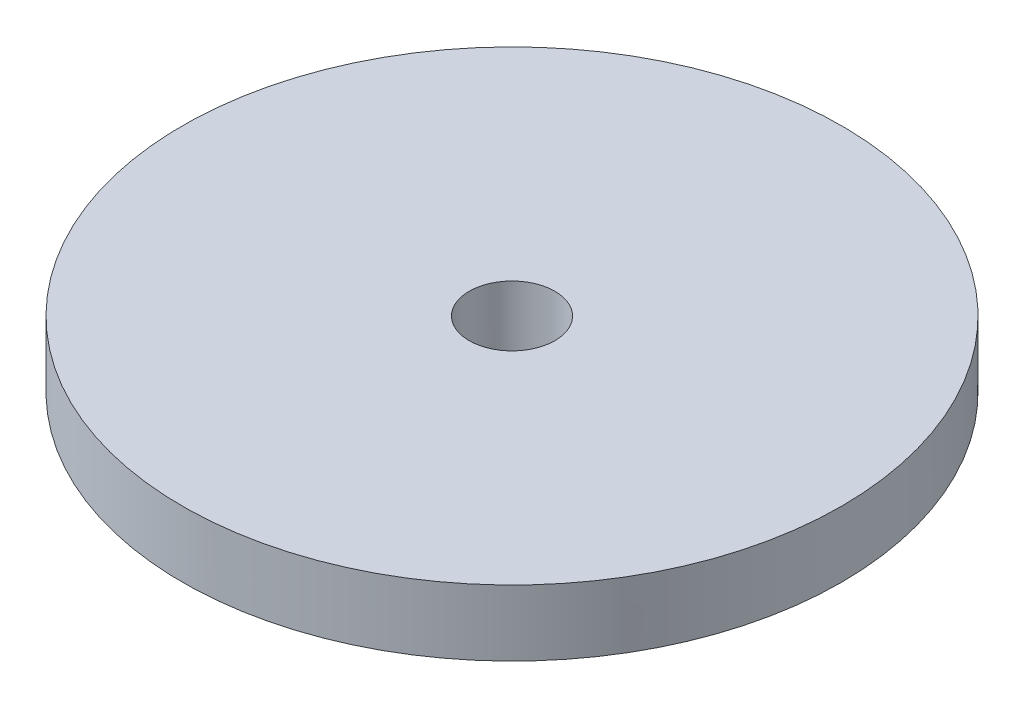
ISO-10303-21;
HEADER;
FILE_DESCRIPTION(('STEP AP214'),'2;1');
FILE_NAME('part.step','',(''),(''),'','','');
FILE_SCHEMA(('AUTOMOTIVE_DESIGN { 1 0 10303 214 1 1 1 1 }'));
ENDSEC;
DATA;
#1=APPLICATION_CONTEXT('core data for automotive mechanical design processes');
#2=APPLICATION_PROTOCOL_DEFINITION('international standard','automotive_design',2000,#1);
#3=PRODUCT_CONTEXT('',#1,'mechanical');
#4=PRODUCT('Part','Part','',(#3));
#5=PRODUCT_RELATED_PRODUCT_CATEGORY('part','',(#4));
#6=PRODUCT_DEFINITION_FORMATION('','',#4);
#7=PRODUCT_DEFINITION_CONTEXT('part definition',#1,'design');
#8=PRODUCT_DEFINITION('design','',#6,#7);
#9=PRODUCT_DEFINITION_SHAPE('','',#8);
#10=(LENGTH_UNIT() NAMED_UNIT(*) SI_UNIT(.MILLI.,.METRE.));
#11=(NAMED_UNIT(*) PLANE_ANGLE_UNIT() SI_UNIT($,.RADIAN.));
#12=(NAMED_UNIT(*) SI_UNIT($,.STERADIAN.) SOLID_ANGLE_UNIT());
#13=UNCERTAINTY_MEASURE_WITH_UNIT(LENGTH_MEASURE(1.E-05),#10,'distance_accuracy_value','');
#14=(GEOMETRIC_REPRESENTATION_CONTEXT(3) GLOBAL_UNCERTAINTY_ASSIGNED_CONTEXT((#13)) GLOBAL_UNIT_ASSIGNED_CONTEXT((#10,
#11,#12)) REPRESENTATION_CONTEXT('',''));
#15=CARTESIAN_POINT('',(0.,0.,0.));
#16=DIRECTION('',(0.,0.,1.));
#17=DIRECTION('',(1.,0.,0.));
#18=AXIS2_PLACEMENT_3D('',#15,#16,#17);
#19=CARTESIAN_POINT('',(-3.37499999139708,-159.999999991395,20.));
#20=DIRECTION('',(0.,-1.,0.));
#21=DIRECTION('',(1.,0.,0.));
#22=AXIS2_PLACEMENT_3D('',#19,#20,#21);
#23=CYLINDRICAL_SURFACE('',#22,5.19999999999998);
#24=CARTESIAN_POINT('',(-3.37499999139708,-41.1999999827912,20.));
#25=DIRECTION('',(0.,-1.,0.));
#26=DIRECTION('',(1.,0.,0.));
#27=AXIS2_PLACEMENT_3D('',#24,#25,#26);
#28=CIRCLE('',#27,5.19999999999998);
#29=CARTESIAN_POINT('',(1.8250000086029,-41.1999999827912,20.));
#30=VERTEX_POINT('',#29);
#31=EDGE_CURVE('E169',#30,#30,#28,.T.);
#32=ORIENTED_EDGE('',*,*,#31,.F.);
#33=EDGE_LOOP('',(#32));
#34=FACE_BOUND('',#33,.T.);
#35=CARTESIAN_POINT('',(-3.37499999139708,-55.250337466263,20.));
#36=DIRECTION('',(0.,-1.,0.));
#37=DIRECTION('',(0.,0.,-1.));
#38=AXIS2_PLACEMENT_3D('',#35,#36,#37);
#39=CIRCLE('',#38,5.19999999999998);
#40=CARTESIAN_POINT('',(-3.37499999139708,-55.250337466263,14.8));
#41=VERTEX_POINT('',#40);
#42=EDGE_CURVE('E44',#41,#41,#39,.T.);
#43=ORIENTED_EDGE('',*,*,#42,.T.);
#44=EDGE_LOOP('',(#43));
#45=FACE_BOUND('',#44,.T.);
#46=ADVANCED_FACE('F40',(#34,#45),#23,.F.);
#47=CARTESIAN_POINT('',(-3.37499999139708,-159.999999991395,20.));
#48=DIRECTION('',(0.,-1.,0.));
#49=DIRECTION('',(1.,0.,0.));
#50=AXIS2_PLACEMENT_3D('',#47,#48,#49);
#51=CYLINDRICAL_SURFACE('',#50,40.);
#52=CARTESIAN_POINT('',(-3.37499999139708,-41.1999999827912,20.));
#53=DIRECTION('',(0.,-1.,0.));
#54=DIRECTION('',(1.,0.,0.));
#55=AXIS2_PLACEMENT_3D('',#52,#53,#54);
#56=CIRCLE('',#55,40.);
#57=CARTESIAN_POINT('',(36.6250000086029,-41.1999999827912,20.));
#58=VERTEX_POINT('',#57);
#59=EDGE_CURVE('E165',#58,#58,#56,.T.);
#60=ORIENTED_EDGE('',*,*,#59,.T.);
#61=EDGE_LOOP('',(#60));
#62=FACE_BOUND('',#61,.T.);
#63=CARTESIAN_POINT('',(-3.37499999139708,-49.1999999827912,20.));
#64=DIRECTION('',(0.,-1.,0.));
#65=DIRECTION('',(1.,0.,0.));
#66=AXIS2_PLACEMENT_3D('',#63,#64,#65);
#67=CIRCLE('',#66,40.);
#68=CARTESIAN_POINT('',(-43.3749999913971,-49.1999999827912,20.));
#69=VERTEX_POINT('',#68);
#70=EDGE_CURVE('E11',#69,#69,#67,.T.);
#71=ORIENTED_EDGE('',*,*,#70,.F.);
#72=EDGE_LOOP('',(#71));
#73=FACE_BOUND('',#72,.T.);
#74=ADVANCED_FACE('F42',(#62,#73),#51,.T.);
#75=CARTESIAN_POINT('',(-3.37499999139708,-65.250337466263,20.));
#76=DIRECTION('',(0.,1.,0.));
#77=DIRECTION('',(-1.,0.,0.));
#78=AXIS2_PLACEMENT_3D('',#75,#76,#77);
#79=CONICAL_SURFACE('',#78,12.2,1.04719755119659);
#80=CARTESIAN_POINT('',(-3.37499999139708,-65.250337466263,20.));
#81=DIRECTION('',(0.,-1.,0.));
#82=DIRECTION('',(1.,0.,0.));
#83=AXIS2_PLACEMENT_3D('',#80,#81,#82);
#84=CIRCLE('',#83,12.2);
#85=CARTESIAN_POINT('',(-15.574999991397,-65.250337466263,20.));
#86=VERTEX_POINT('',#85);
#87=EDGE_CURVE('E50',#86,#86,#84,.T.);
#88=CARTESIAN_POINT('',(-43.3749999913971,-49.1999999827912,20.));
#89=CARTESIAN_POINT('',(-43.0854166580637,-49.3671909982441,20.));
#90=CARTESIAN_POINT('',(-42.7958333247304,-49.5343820136969,20.));
#91=CARTESIAN_POINT('',(-42.2166666580637,-49.8687640446026,20.));
#92=CARTESIAN_POINT('',(-41.9270833247304,-50.0359550600554,20.));
#93=CARTESIAN_POINT('',(-41.3479166580637,-50.3703370909611,20.));
#94=CARTESIAN_POINT('',(-41.0583333247304,-50.5375281064139,20.));
#95=CARTESIAN_POINT('',(-40.4791666580637,-50.8719101373196,20.));
#96=CARTESIAN_POINT('',(-40.1895833247304,-51.0391011527724,20.));
#97=CARTESIAN_POINT('',(-39.6104166580637,-51.373483183678,20.));
#98=CARTESIAN_POINT('',(-39.3208333247304,-51.5406741991309,20.));
#99=CARTESIAN_POINT('',(-38.7416666580637,-51.8750562300365,20.));
#100=CARTESIAN_POINT('',(-38.4520833247304,-52.0422472454894,20.));
#101=CARTESIAN_POINT('',(-37.8729166580637,-52.376629276395,20.));
#102=CARTESIAN_POINT('',(-37.5833333247304,-52.5438202918479,20.));
#103=CARTESIAN_POINT('',(-37.0041666580637,-52.8782023227535,20.));
#104=CARTESIAN_POINT('',(-36.7145833247304,-53.0453933382064,20.));
#105=CARTESIAN_POINT('',(-36.1354166580637,-53.379775369112,20.));
#106=CARTESIAN_POINT('',(-35.8458333247304,-53.5469663845648,20.));
#107=CARTESIAN_POINT('',(-35.2666666580637,-53.8813484154705,20.));
#108=CARTESIAN_POINT('',(-34.9770833247304,-54.0485394309233,20.));
#109=CARTESIAN_POINT('',(-34.3979166580637,-54.382921461829,20.));
#110=CARTESIAN_POINT('',(-34.1083333247304,-54.5501124772818,20.));
#111=CARTESIAN_POINT('',(-33.5291666580637,-54.8844945081875,20.));
#112=CARTESIAN_POINT('',(-33.2395833247304,-55.0516855236403,20.));
#113=CARTESIAN_POINT('',(-32.6604166580637,-55.386067554546,20.));
#114=CARTESIAN_POINT('',(-32.3708333247304,-55.5532585699988,20.));
#115=CARTESIAN_POINT('',(-31.7916666580637,-55.8876406009045,20.));
#116=CARTESIAN_POINT('',(-31.5020833247304,-56.0548316163573,20.));
#117=CARTESIAN_POINT('',(-30.9229166580637,-56.389213647263,20.));
#118=CARTESIAN_POINT('',(-30.6333333247304,-56.5564046627158,20.));
#119=CARTESIAN_POINT('',(-30.0541666580637,-56.8907866936215,20.));
#120=CARTESIAN_POINT('',(-29.7645833247304,-57.0579777090743,20.));
#121=CARTESIAN_POINT('',(-29.1854166580637,-57.39235973998,20.));
#122=CARTESIAN_POINT('',(-28.8958333247304,-57.5595507554328,20.));
#123=CARTESIAN_POINT('',(-28.3166666580637,-57.8939327863385,20.));
#124=CARTESIAN_POINT('',(-28.0270833247304,-58.0611238017913,20.));
#125=CARTESIAN_POINT('',(-27.4479166580637,-58.395505832697,20.));
#126=CARTESIAN_POINT('',(-27.1583333247304,-58.5626968481498,20.));
#127=CARTESIAN_POINT('',(-26.5791666580637,-58.8970788790554,20.));
#128=CARTESIAN_POINT('',(-26.2895833247304,-59.0642698945083,20.));
#129=CARTESIAN_POINT('',(-25.7104166580637,-59.3986519254139,20.));
#130=CARTESIAN_POINT('',(-25.4208333247304,-59.5658429408668,20.));
#131=CARTESIAN_POINT('',(-24.8416666580637,-59.9002249717724,20.));
#132=CARTESIAN_POINT('',(-24.5520833247304,-60.0674159872253,20.));
#133=CARTESIAN_POINT('',(-23.9729166580637,-60.4017980181309,20.));
#134=CARTESIAN_POINT('',(-23.6833333247304,-60.5689890335838,20.));
#135=CARTESIAN_POINT('',(-23.1041666580637,-60.9033710644894,20.));
#136=CARTESIAN_POINT('',(-22.8145833247304,-61.0705620799422,20.));
#137=CARTESIAN_POINT('',(-22.2354166580637,-61.4049441108479,20.));
#138=CARTESIAN_POINT('',(-21.9458333247304,-61.5721351263007,20.));
#139=CARTESIAN_POINT('',(-21.3666666580637,-61.9065171572064,20.));
#140=CARTESIAN_POINT('',(-21.0770833247304,-62.0737081726592,20.));
#141=CARTESIAN_POINT('',(-20.4979166580637,-62.4080902035649,20.));
#142=CARTESIAN_POINT('',(-20.2083333247304,-62.5752812190177,20.));
#143=CARTESIAN_POINT('',(-19.6291666580637,-62.9096632499234,20.));
#144=CARTESIAN_POINT('',(-19.3395833247304,-63.0768542653762,20.));
#145=CARTESIAN_POINT('',(-18.7604166580637,-63.4112362962819,20.));
#146=CARTESIAN_POINT('',(-18.4708333247304,-63.5784273117347,20.));
#147=CARTESIAN_POINT('',(-17.8916666580637,-63.9128093426404,20.));
#148=CARTESIAN_POINT('',(-17.6020833247304,-64.0800003580932,20.));
#149=CARTESIAN_POINT('',(-17.0229166580637,-64.4143823889989,20.));
#150=CARTESIAN_POINT('',(-16.7333333247304,-64.5815734044517,20.));
#151=CARTESIAN_POINT('',(-16.1541666580637,-64.9159554353574,20.));
#152=CARTESIAN_POINT('',(-15.8645833247304,-65.0831464508102,20.));
#153=CARTESIAN_POINT('',(-15.574999991397,-65.250337466263,20.));
#154=B_SPLINE_CURVE_WITH_KNOTS('',3,(#88,#89,#90,#91,#92,#93,#94,#95,#96,#97,#98,#99,#100,#101,
#102,#103,#104,#105,#106,#107,#108,#109,#110,#111,#112,#113,#114,#115,#116,#117,#118,#119,#120,
#121,#122,#123,#124,#125,#126,#127,#128,#129,#130,#131,#132,#133,#134,#135,#136,#137,#138,#139,
#140,#141,#142,#143,#144,#145,#146,#147,#148,#149,#150,#151,#152,#153),.UNSPECIFIED.,.F.,.F.,(4,
2,2,2,2,2,2,2,2,2,2,2,2,2,2,2,2,2,2,2,2,2,2,2,2,2,2,2,2,2,2,2,4),(0.,1.00314609271698,
2.00629218543396,3.00943827815094,4.01258437086792,5.01573046358489,6.01887655630187,
7.02202264901885,8.02516874173583,9.0283148344528,10.0314609271698,11.0346070198868,
12.0377531126037,13.0408992053207,14.0440452980377,15.0471913907547,16.0503374834717,
17.0534835761886,18.0566296689056,19.0597757616226,20.0629218543396,21.0660679470565,
22.0692140397735,23.0723601324905,24.0755062252075,25.0786523179245,26.0817984106414,
27.0849445033584,28.0880905960754,29.0912366887924,30.0943827815093,31.0975288742263,
32.1006749669433),.UNSPECIFIED.);
#155=EDGE_CURVE('BSEAM179',#69,#86,#154,.T.);
#156=ORIENTED_EDGE('',*,*,#70,.T.);
#157=ORIENTED_EDGE('',*,*,#87,.F.);
#158=ORIENTED_EDGE('',*,*,#155,.T.);
#159=ORIENTED_EDGE('',*,*,#155,.F.);
#160=EDGE_LOOP('',(#156,#158,#157,#159));
#161=FACE_BOUND('',#160,.T.);
#162=ADVANCED_FACE('F179',(#161),#79,.T.);
#163=CARTESIAN_POINT('',(8.8250000086029,-65.250337466263,20.));
#164=DIRECTION('',(0.,-1.,0.));
#165=DIRECTION('',(1.,0.,0.));
#166=AXIS2_PLACEMENT_3D('',#163,#164,#165);
#167=PLANE('',#166);
#168=DIRECTION('',(-0.866025403784438,0.,0.5));
#169=VECTOR('',#168,1.);
#170=CARTESIAN_POINT('',(5.17500000860292,-65.250337466263,24.9363448015713));
#171=LINE('',#170,#169);
#172=CARTESIAN_POINT('',(5.17500000860292,-65.250337466263,24.9363448015713));
#173=VERTEX_POINT('',#172);
#174=CARTESIAN_POINT('',(-3.37499999139708,-65.250337466263,29.8726896031426));
#175=VERTEX_POINT('',#174);
#176=EDGE_CURVE('E57',#173,#175,#171,.T.);
#177=ORIENTED_EDGE('',*,*,#176,.F.);
#178=DIRECTION('',(0.,0.,1.));
#179=VECTOR('',#178,1.);
#180=CARTESIAN_POINT('',(5.17500000860292,-65.250337466263,15.0636551984287));
#181=LINE('',#180,#179);
#182=CARTESIAN_POINT('',(5.17500000860292,-65.250337466263,15.0636551984287));
#183=VERTEX_POINT('',#182);
#184=EDGE_CURVE('E150',#183,#173,#181,.T.);
#185=ORIENTED_EDGE('',*,*,#184,.F.);
#186=DIRECTION('',(0.866025403784439,0.,0.5));
#187=VECTOR('',#186,1.);
#188=CARTESIAN_POINT('',(-3.37499999139708,-65.250337466263,10.1273103968574));
#189=LINE('',#188,#187);
#190=CARTESIAN_POINT('',(-3.37499999139708,-65.250337466263,10.1273103968574));
#191=VERTEX_POINT('',#190);
#192=EDGE_CURVE('E147',#191,#183,#189,.T.);
#193=ORIENTED_EDGE('',*,*,#192,.F.);
#194=DIRECTION('',(0.866025403784439,0.,-0.5));
#195=VECTOR('',#194,1.);
#196=CARTESIAN_POINT('',(-11.9249999913971,-65.250337466263,15.0636551984287));
#197=LINE('',#196,#195);
#198=CARTESIAN_POINT('',(-11.9249999913971,-65.250337466263,15.0636551984287));
#199=VERTEX_POINT('',#198);
#200=EDGE_CURVE('E105',#199,#191,#197,.T.);
#201=ORIENTED_EDGE('',*,*,#200,.F.);
#202=DIRECTION('',(0.,0.,-1.));
#203=VECTOR('',#202,1.);
#204=CARTESIAN_POINT('',(-11.9249999913971,-65.250337466263,24.9363448015713));
#205=LINE('',#204,#203);
#206=CARTESIAN_POINT('',(-11.9249999913971,-65.250337466263,24.9363448015713));
#207=VERTEX_POINT('',#206);
#208=EDGE_CURVE('E141',#207,#199,#205,.T.);
#209=ORIENTED_EDGE('',*,*,#208,.F.);
#210=DIRECTION('',(-0.866025403784439,0.,-0.5));
#211=VECTOR('',#210,1.);
#212=CARTESIAN_POINT('',(-3.37499999139708,-65.250337466263,29.8726896031426));
#213=LINE('',#212,#211);
#214=EDGE_CURVE('E137',#175,#207,#213,.T.);
#215=ORIENTED_EDGE('',*,*,#214,.F.);
#216=EDGE_LOOP('',(#177,#185,#193,#201,#209,#215));
#217=FACE_BOUND('',#216,.T.);
#218=ORIENTED_EDGE('',*,*,#87,.T.);
#219=EDGE_LOOP('',(#218));
#220=FACE_BOUND('',#219,.T.);
#221=ADVANCED_FACE('F177',(#217,#220),#167,.T.);
#222=CARTESIAN_POINT('',(1.8250000086029,-41.1999999827912,20.));
#223=DIRECTION('',(0.,1.,0.));
#224=DIRECTION('',(-1.,0.,0.));
#225=AXIS2_PLACEMENT_3D('',#222,#223,#224);
#226=PLANE('',#225);
#227=ORIENTED_EDGE('',*,*,#31,.T.);
#228=EDGE_LOOP('',(#227));
#229=FACE_BOUND('',#228,.T.);
#230=ORIENTED_EDGE('',*,*,#59,.F.);
#231=EDGE_LOOP('',(#230));
#232=FACE_BOUND('',#231,.T.);
#233=ADVANCED_FACE('F186',(#229,#232),#226,.T.);
#234=CARTESIAN_POINT('',(5.17500000860292,-55.250337466263,24.9363448015713));
#235=DIRECTION('',(0.5,0.,0.866025403784439));
#236=DIRECTION('',(0.866025403784439,0.,-0.5));
#237=AXIS2_PLACEMENT_3D('',#234,#235,#236);
#238=PLANE('',#237);
#239=ORIENTED_EDGE('',*,*,#176,.T.);
#240=DIRECTION('',(0.,-1.,0.));
#241=VECTOR('',#240,1.);
#242=CARTESIAN_POINT('',(-3.37499999139708,-55.250337466263,29.8726896031426));
#243=LINE('',#242,#241);
#244=CARTESIAN_POINT('',(-3.37499999139708,-55.250337466263,29.8726896031426));
#245=VERTEX_POINT('',#244);
#246=EDGE_CURVE('E87',#245,#175,#243,.T.);
#247=ORIENTED_EDGE('',*,*,#246,.F.);
#248=DIRECTION('',(-0.866025403784438,0.,0.5));
#249=VECTOR('',#248,1.);
#250=CARTESIAN_POINT('',(5.17500000860292,-55.250337466263,24.9363448015713));
#251=LINE('',#250,#249);
#252=CARTESIAN_POINT('',(5.17500000860292,-55.250337466263,24.9363448015713));
#253=VERTEX_POINT('',#252);
#254=EDGE_CURVE('E153',#253,#245,#251,.T.);
#255=ORIENTED_EDGE('',*,*,#254,.F.);
#256=DIRECTION('',(0.,-1.,0.));
#257=VECTOR('',#256,1.);
#258=CARTESIAN_POINT('',(5.17500000860292,-55.250337466263,24.9363448015713));
#259=LINE('',#258,#257);
#260=EDGE_CURVE('E65',#253,#173,#259,.T.);
#261=ORIENTED_EDGE('',*,*,#260,.T.);
#262=EDGE_LOOP('',(#239,#247,#255,#261));
#263=FACE_BOUND('',#262,.T.);
#264=ADVANCED_FACE('F200',(#263),#238,.F.);
#265=CARTESIAN_POINT('',(5.17500000860292,-55.250337466263,15.0636551984287));
#266=DIRECTION('',(1.,0.,0.));
#267=DIRECTION('',(0.,0.,-1.));
#268=AXIS2_PLACEMENT_3D('',#265,#266,#267);
#269=PLANE('',#268);
#270=ORIENTED_EDGE('',*,*,#184,.T.);
#271=ORIENTED_EDGE('',*,*,#260,.F.);
#272=DIRECTION('',(0.,0.,1.));
#273=VECTOR('',#272,1.);
#274=CARTESIAN_POINT('',(5.17500000860292,-55.250337466263,15.0636551984287));
#275=LINE('',#274,#273);
#276=CARTESIAN_POINT('',(5.17500000860292,-55.250337466263,15.0636551984287));
#277=VERTEX_POINT('',#276);
#278=EDGE_CURVE('E119',#277,#253,#275,.T.);
#279=ORIENTED_EDGE('',*,*,#278,.F.);
#280=DIRECTION('',(0.,-1.,0.));
#281=VECTOR('',#280,1.);
#282=CARTESIAN_POINT('',(5.17500000860292,-55.250337466263,15.0636551984287));
#283=LINE('',#282,#281);
#284=EDGE_CURVE('E110',#277,#183,#283,.T.);
#285=ORIENTED_EDGE('',*,*,#284,.T.);
#286=EDGE_LOOP('',(#270,#271,#279,#285));
#287=FACE_BOUND('',#286,.T.);
#288=ADVANCED_FACE('F204',(#287),#269,.F.);
#289=CARTESIAN_POINT('',(-3.37499999139708,-55.250337466263,10.1273103968574));
#290=DIRECTION('',(0.5,0.,-0.866025403784438));
#291=DIRECTION('',(-0.866025403784439,0.,-0.5));
#292=AXIS2_PLACEMENT_3D('',#289,#290,#291);
#293=PLANE('',#292);
#294=ORIENTED_EDGE('',*,*,#192,.T.);
#295=ORIENTED_EDGE('',*,*,#284,.F.);
#296=DIRECTION('',(0.866025403784439,0.,0.5));
#297=VECTOR('',#296,1.);
#298=CARTESIAN_POINT('',(-3.37499999139708,-55.250337466263,10.1273103968574));
#299=LINE('',#298,#297);
#300=CARTESIAN_POINT('',(-3.37499999139708,-55.250337466263,10.1273103968574));
#301=VERTEX_POINT('',#300);
#302=EDGE_CURVE('E114',#301,#277,#299,.T.);
#303=ORIENTED_EDGE('',*,*,#302,.F.);
#304=DIRECTION('',(0.,-1.,0.));
#305=VECTOR('',#304,1.);
#306=CARTESIAN_POINT('',(-3.37499999139708,-55.250337466263,10.1273103968574));
#307=LINE('',#306,#305);
#308=EDGE_CURVE('E98',#301,#191,#307,.T.);
#309=ORIENTED_EDGE('',*,*,#308,.T.);
#310=EDGE_LOOP('',(#294,#295,#303,#309));
#311=FACE_BOUND('',#310,.T.);
#312=ADVANCED_FACE('F115',(#311),#293,.F.);
#313=CARTESIAN_POINT('',(-11.9249999913971,-55.250337466263,15.0636551984287));
#314=DIRECTION('',(-0.5,0.,-0.866025403784439));
#315=DIRECTION('',(-0.866025403784439,0.,0.5));
#316=AXIS2_PLACEMENT_3D('',#313,#314,#315);
#317=PLANE('',#316);
#318=ORIENTED_EDGE('',*,*,#200,.T.);
#319=ORIENTED_EDGE('',*,*,#308,.F.);
#320=DIRECTION('',(0.866025403784439,0.,-0.5));
#321=VECTOR('',#320,1.);
#322=CARTESIAN_POINT('',(-11.9249999913971,-55.250337466263,15.0636551984287));
#323=LINE('',#322,#321);
#324=CARTESIAN_POINT('',(-11.9249999913971,-55.250337466263,15.0636551984287));
#325=VERTEX_POINT('',#324);
#326=EDGE_CURVE('E102',#325,#301,#323,.T.);
#327=ORIENTED_EDGE('',*,*,#326,.F.);
#328=DIRECTION('',(0.,-1.,0.));
#329=VECTOR('',#328,1.);
#330=CARTESIAN_POINT('',(-11.9249999913971,-55.250337466263,15.0636551984287));
#331=LINE('',#330,#329);
#332=EDGE_CURVE('E111',#325,#199,#331,.T.);
#333=ORIENTED_EDGE('',*,*,#332,.T.);
#334=EDGE_LOOP('',(#318,#319,#327,#333));
#335=FACE_BOUND('',#334,.T.);
#336=ADVANCED_FACE('F100',(#335),#317,.F.);
#337=CARTESIAN_POINT('',(-11.9249999913971,-55.250337466263,24.9363448015713));
#338=DIRECTION('',(-1.,0.,0.));
#339=DIRECTION('',(0.,-1.,0.));
#340=AXIS2_PLACEMENT_3D('',#337,#338,#339);
#341=PLANE('',#340);
#342=ORIENTED_EDGE('',*,*,#208,.T.);
#343=ORIENTED_EDGE('',*,*,#332,.F.);
#344=DIRECTION('',(0.,0.,-1.));
#345=VECTOR('',#344,1.);
#346=CARTESIAN_POINT('',(-11.9249999913971,-55.250337466263,24.9363448015713));
#347=LINE('',#346,#345);
#348=CARTESIAN_POINT('',(-11.9249999913971,-55.250337466263,24.9363448015713));
#349=VERTEX_POINT('',#348);
#350=EDGE_CURVE('E125',#349,#325,#347,.T.);
#351=ORIENTED_EDGE('',*,*,#350,.F.);
#352=DIRECTION('',(0.,-1.,0.));
#353=VECTOR('',#352,1.);
#354=CARTESIAN_POINT('',(-11.9249999913971,-55.250337466263,24.9363448015713));
#355=LINE('',#354,#353);
#356=EDGE_CURVE('E160',#349,#207,#355,.T.);
#357=ORIENTED_EDGE('',*,*,#356,.T.);
#358=EDGE_LOOP('',(#342,#343,#351,#357));
#359=FACE_BOUND('',#358,.T.);
#360=ADVANCED_FACE('F208',(#359),#341,.F.);
#361=CARTESIAN_POINT('',(-3.37499999139708,-55.250337466263,29.8726896031426));
#362=DIRECTION('',(-0.5,0.,0.866025403784438));
#363=DIRECTION('',(0.866025403784438,0.,0.5));
#364=AXIS2_PLACEMENT_3D('',#361,#362,#363);
#365=PLANE('',#364);
#366=ORIENTED_EDGE('',*,*,#214,.T.);
#367=ORIENTED_EDGE('',*,*,#356,.F.);
#368=DIRECTION('',(-0.866025403784439,0.,-0.5));
#369=VECTOR('',#368,1.);
#370=CARTESIAN_POINT('',(-3.37499999139708,-55.250337466263,29.8726896031426));
#371=LINE('',#370,#369);
#372=EDGE_CURVE('E129',#245,#349,#371,.T.);
#373=ORIENTED_EDGE('',*,*,#372,.F.);
#374=ORIENTED_EDGE('',*,*,#246,.T.);
#375=EDGE_LOOP('',(#366,#367,#373,#374));
#376=FACE_BOUND('',#375,.T.);
#377=ADVANCED_FACE('F205',(#376),#365,.F.);
#378=CARTESIAN_POINT('',(0.,-55.250337466263,0.));
#379=DIRECTION('',(0.,-1.,0.));
#380=DIRECTION('',(0.,0.,-1.));
#381=AXIS2_PLACEMENT_3D('',#378,#379,#380);
#382=PLANE('',#381);
#383=ORIENTED_EDGE('',*,*,#42,.F.);
#384=EDGE_LOOP('',(#383));
#385=FACE_BOUND('',#384,.T.);
#386=ORIENTED_EDGE('',*,*,#254,.T.);
#387=ORIENTED_EDGE('',*,*,#372,.T.);
#388=ORIENTED_EDGE('',*,*,#350,.T.);
#389=ORIENTED_EDGE('',*,*,#326,.T.);
#390=ORIENTED_EDGE('',*,*,#302,.T.);
#391=ORIENTED_EDGE('',*,*,#278,.T.);
#392=EDGE_LOOP('',(#386,#387,#388,#389,#390,#391));
#393=FACE_BOUND('',#392,.T.);
#394=ADVANCED_FACE('F122',(#385,#393),#382,.T.);
#395=CLOSED_SHELL('',(#46,#74,#162,#221,#233,#264,#288,#312,#336,#360,#377,#394));
#396=MANIFOLD_SOLID_BREP('B2',#395);
#397=ADVANCED_BREP_SHAPE_REPRESENTATION('',(#18,#396),#14);
#398=SHAPE_DEFINITION_REPRESENTATION(#9,#397);
ENDSEC;
END-ISO-10303-21;
